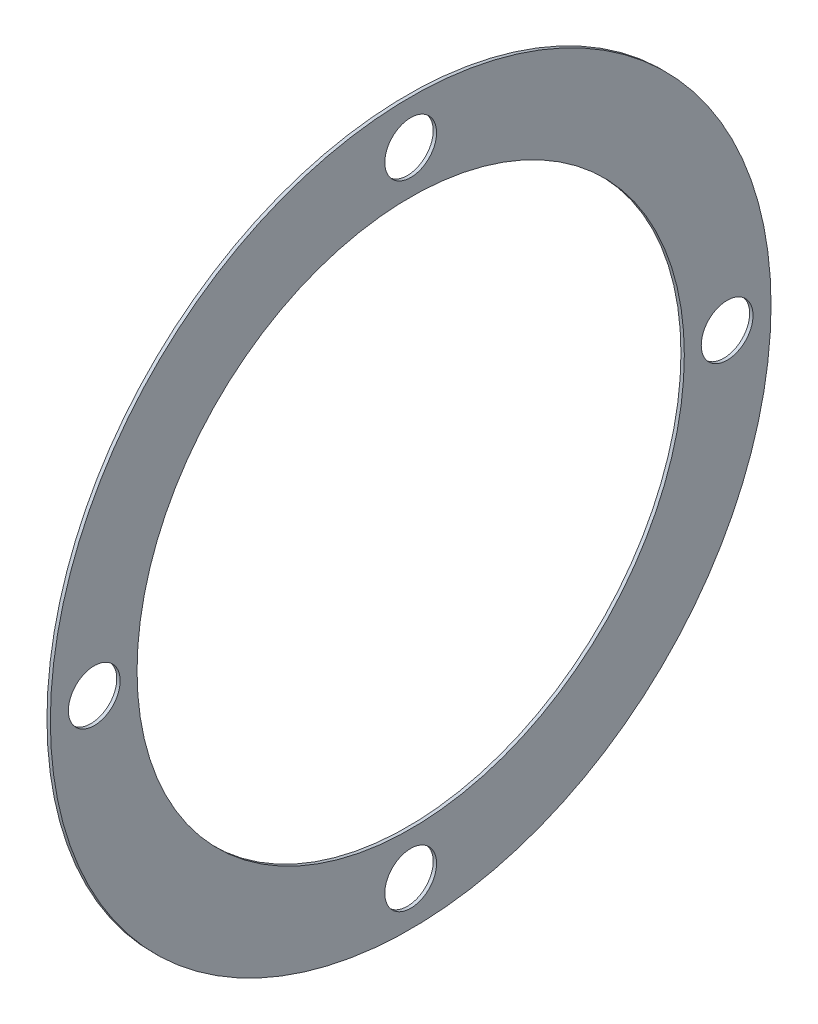
ISO-10303-21;
HEADER;
FILE_DESCRIPTION(('STEP AP214'),'2;1');
FILE_NAME('part.step','',(''),(''),'','','');
FILE_SCHEMA(('AUTOMOTIVE_DESIGN { 1 0 10303 214 1 1 1 1 }'));
ENDSEC;
DATA;
#1=APPLICATION_CONTEXT('core data for automotive mechanical design processes');
#2=APPLICATION_PROTOCOL_DEFINITION('international standard','automotive_design',2000,#1);
#3=PRODUCT_CONTEXT('',#1,'mechanical');
#4=PRODUCT('Part','Part','',(#3));
#5=PRODUCT_RELATED_PRODUCT_CATEGORY('part','',(#4));
#6=PRODUCT_DEFINITION_FORMATION('','',#4);
#7=PRODUCT_DEFINITION_CONTEXT('part definition',#1,'design');
#8=PRODUCT_DEFINITION('design','',#6,#7);
#9=PRODUCT_DEFINITION_SHAPE('','',#8);
#10=(LENGTH_UNIT() NAMED_UNIT(*) SI_UNIT(.MILLI.,.METRE.));
#11=(NAMED_UNIT(*) PLANE_ANGLE_UNIT() SI_UNIT($,.RADIAN.));
#12=(NAMED_UNIT(*) SI_UNIT($,.STERADIAN.) SOLID_ANGLE_UNIT());
#13=UNCERTAINTY_MEASURE_WITH_UNIT(LENGTH_MEASURE(1.E-05),#10,'distance_accuracy_value','');
#14=(GEOMETRIC_REPRESENTATION_CONTEXT(3) GLOBAL_UNCERTAINTY_ASSIGNED_CONTEXT((#13)) GLOBAL_UNIT_ASSIGNED_CONTEXT((#10,
#11,#12)) REPRESENTATION_CONTEXT('',''));
#15=CARTESIAN_POINT('',(0.,0.,0.));
#16=DIRECTION('',(0.,0.,1.));
#17=DIRECTION('',(1.,0.,0.));
#18=AXIS2_PLACEMENT_3D('',#15,#16,#17);
#19=CARTESIAN_POINT('',(0.,0.,0.));
#20=DIRECTION('',(-1.,0.,0.));
#21=DIRECTION('',(0.,0.,1.));
#22=AXIS2_PLACEMENT_3D('',#19,#20,#21);
#23=PLANE('',#22);
#24=CARTESIAN_POINT('',(0.,0.,0.));
#25=DIRECTION('',(-1.,0.,0.));
#26=DIRECTION('',(0.,0.,1.));
#27=AXIS2_PLACEMENT_3D('',#24,#25,#26);
#28=CIRCLE('',#27,16.);
#29=CARTESIAN_POINT('',(0.,0.,16.));
#30=VERTEX_POINT('',#29);
#31=EDGE_CURVE('E41',#30,#30,#28,.T.);
#32=ORIENTED_EDGE('',*,*,#31,.F.);
#33=EDGE_LOOP('',(#32));
#34=FACE_BOUND('',#33,.T.);
#35=CARTESIAN_POINT('',(0.,0.,0.));
#36=DIRECTION('',(-1.,0.,0.));
#37=DIRECTION('',(0.,0.,1.));
#38=AXIS2_PLACEMENT_3D('',#35,#36,#37);
#39=CIRCLE('',#38,12.15);
#40=CARTESIAN_POINT('',(0.,0.,12.15));
#41=VERTEX_POINT('',#40);
#42=EDGE_CURVE('E44',#41,#41,#39,.T.);
#43=ORIENTED_EDGE('',*,*,#42,.T.);
#44=EDGE_LOOP('',(#43));
#45=FACE_BOUND('',#44,.T.);
#46=CARTESIAN_POINT('',(0.,14.05,0.));
#47=DIRECTION('',(-1.,0.,0.));
#48=DIRECTION('',(0.,0.,1.));
#49=AXIS2_PLACEMENT_3D('',#46,#47,#48);
#50=CIRCLE('',#49,1.15);
#51=CARTESIAN_POINT('',(0.,14.05,1.15));
#52=VERTEX_POINT('',#51);
#53=EDGE_CURVE('E47',#52,#52,#50,.T.);
#54=ORIENTED_EDGE('',*,*,#53,.T.);
#55=EDGE_LOOP('',(#54));
#56=FACE_BOUND('',#55,.T.);
#57=CARTESIAN_POINT('',(0.,0.,14.05));
#58=DIRECTION('',(-1.,0.,0.));
#59=DIRECTION('',(0.,0.,1.));
#60=AXIS2_PLACEMENT_3D('',#57,#58,#59);
#61=CIRCLE('',#60,1.15);
#62=CARTESIAN_POINT('',(0.,0.,15.2));
#63=VERTEX_POINT('',#62);
#64=EDGE_CURVE('E50',#63,#63,#61,.T.);
#65=ORIENTED_EDGE('',*,*,#64,.T.);
#66=EDGE_LOOP('',(#65));
#67=FACE_BOUND('',#66,.T.);
#68=CARTESIAN_POINT('',(0.,-14.05,0.));
#69=DIRECTION('',(-1.,0.,0.));
#70=DIRECTION('',(0.,0.,1.));
#71=AXIS2_PLACEMENT_3D('',#68,#69,#70);
#72=CIRCLE('',#71,1.15);
#73=CARTESIAN_POINT('',(0.,-14.05,1.15));
#74=VERTEX_POINT('',#73);
#75=EDGE_CURVE('E52',#74,#74,#72,.T.);
#76=ORIENTED_EDGE('',*,*,#75,.T.);
#77=EDGE_LOOP('',(#76));
#78=FACE_BOUND('',#77,.T.);
#79=CARTESIAN_POINT('',(0.,0.,-14.05));
#80=DIRECTION('',(-1.,0.,0.));
#81=DIRECTION('',(0.,0.,1.));
#82=AXIS2_PLACEMENT_3D('',#79,#80,#81);
#83=CIRCLE('',#82,1.15);
#84=CARTESIAN_POINT('',(0.,0.,-12.9));
#85=VERTEX_POINT('',#84);
#86=EDGE_CURVE('E18',#85,#85,#83,.T.);
#87=ORIENTED_EDGE('',*,*,#86,.T.);
#88=EDGE_LOOP('',(#87));
#89=FACE_BOUND('',#88,.T.);
#90=ADVANCED_FACE('F15',(#34,#45,#56,#67,#78,#89),#23,.F.);
#91=CARTESIAN_POINT('',(0.,0.,-14.05));
#92=DIRECTION('',(-1.,0.,0.));
#93=DIRECTION('',(0.,0.,1.));
#94=AXIS2_PLACEMENT_3D('',#91,#92,#93);
#95=CYLINDRICAL_SURFACE('',#94,1.15);
#96=ORIENTED_EDGE('',*,*,#86,.F.);
#97=EDGE_LOOP('',(#96));
#98=FACE_BOUND('',#97,.T.);
#99=CARTESIAN_POINT('',(-0.15,0.,-14.05));
#100=DIRECTION('',(-1.,0.,0.));
#101=DIRECTION('',(0.,0.,1.));
#102=AXIS2_PLACEMENT_3D('',#99,#100,#101);
#103=CIRCLE('',#102,1.15);
#104=CARTESIAN_POINT('',(-0.15,0.,-12.9));
#105=VERTEX_POINT('',#104);
#106=EDGE_CURVE('E38',#105,#105,#103,.F.);
#107=ORIENTED_EDGE('',*,*,#106,.F.);
#108=EDGE_LOOP('',(#107));
#109=FACE_BOUND('',#108,.T.);
#110=ADVANCED_FACE('F60',(#98,#109),#95,.F.);
#111=CARTESIAN_POINT('',(0.,-14.05,0.));
#112=DIRECTION('',(-1.,0.,0.));
#113=DIRECTION('',(0.,0.,1.));
#114=AXIS2_PLACEMENT_3D('',#111,#112,#113);
#115=CYLINDRICAL_SURFACE('',#114,1.15);
#116=ORIENTED_EDGE('',*,*,#75,.F.);
#117=EDGE_LOOP('',(#116));
#118=FACE_BOUND('',#117,.T.);
#119=CARTESIAN_POINT('',(-0.15,-14.05,0.));
#120=DIRECTION('',(-1.,0.,0.));
#121=DIRECTION('',(0.,0.,1.));
#122=AXIS2_PLACEMENT_3D('',#119,#120,#121);
#123=CIRCLE('',#122,1.15);
#124=CARTESIAN_POINT('',(-0.15,-14.05,1.15));
#125=VERTEX_POINT('',#124);
#126=EDGE_CURVE('E35',#125,#125,#123,.F.);
#127=ORIENTED_EDGE('',*,*,#126,.F.);
#128=EDGE_LOOP('',(#127));
#129=FACE_BOUND('',#128,.T.);
#130=ADVANCED_FACE('F63',(#118,#129),#115,.F.);
#131=CARTESIAN_POINT('',(0.,0.,14.05));
#132=DIRECTION('',(-1.,0.,0.));
#133=DIRECTION('',(0.,0.,1.));
#134=AXIS2_PLACEMENT_3D('',#131,#132,#133);
#135=CYLINDRICAL_SURFACE('',#134,1.15);
#136=ORIENTED_EDGE('',*,*,#64,.F.);
#137=EDGE_LOOP('',(#136));
#138=FACE_BOUND('',#137,.T.);
#139=CARTESIAN_POINT('',(-0.15,0.,14.05));
#140=DIRECTION('',(-1.,0.,0.));
#141=DIRECTION('',(0.,0.,1.));
#142=AXIS2_PLACEMENT_3D('',#139,#140,#141);
#143=CIRCLE('',#142,1.15);
#144=CARTESIAN_POINT('',(-0.15,0.,15.2));
#145=VERTEX_POINT('',#144);
#146=EDGE_CURVE('E32',#145,#145,#143,.F.);
#147=ORIENTED_EDGE('',*,*,#146,.F.);
#148=EDGE_LOOP('',(#147));
#149=FACE_BOUND('',#148,.T.);
#150=ADVANCED_FACE('F85',(#138,#149),#135,.F.);
#151=CARTESIAN_POINT('',(0.,14.05,0.));
#152=DIRECTION('',(-1.,0.,0.));
#153=DIRECTION('',(0.,0.,1.));
#154=AXIS2_PLACEMENT_3D('',#151,#152,#153);
#155=CYLINDRICAL_SURFACE('',#154,1.15);
#156=ORIENTED_EDGE('',*,*,#53,.F.);
#157=EDGE_LOOP('',(#156));
#158=FACE_BOUND('',#157,.T.);
#159=CARTESIAN_POINT('',(-0.15,14.05,0.));
#160=DIRECTION('',(-1.,0.,0.));
#161=DIRECTION('',(0.,0.,1.));
#162=AXIS2_PLACEMENT_3D('',#159,#160,#161);
#163=CIRCLE('',#162,1.15);
#164=CARTESIAN_POINT('',(-0.15,14.05,1.15));
#165=VERTEX_POINT('',#164);
#166=EDGE_CURVE('E27',#165,#165,#163,.F.);
#167=ORIENTED_EDGE('',*,*,#166,.F.);
#168=EDGE_LOOP('',(#167));
#169=FACE_BOUND('',#168,.T.);
#170=ADVANCED_FACE('F81',(#158,#169),#155,.F.);
#171=CARTESIAN_POINT('',(0.007499999999999,0.,0.));
#172=DIRECTION('',(-1.,0.,0.));
#173=DIRECTION('',(0.,0.,1.));
#174=AXIS2_PLACEMENT_3D('',#171,#172,#173);
#175=CYLINDRICAL_SURFACE('',#174,12.15);
#176=ORIENTED_EDGE('',*,*,#42,.F.);
#177=EDGE_LOOP('',(#176));
#178=FACE_BOUND('',#177,.T.);
#179=CARTESIAN_POINT('',(-0.15,0.,0.));
#180=DIRECTION('',(-1.,0.,0.));
#181=DIRECTION('',(0.,0.,1.));
#182=AXIS2_PLACEMENT_3D('',#179,#180,#181);
#183=CIRCLE('',#182,12.15);
#184=CARTESIAN_POINT('',(-0.15,0.,12.15));
#185=VERTEX_POINT('',#184);
#186=EDGE_CURVE('E22',#185,#185,#183,.F.);
#187=ORIENTED_EDGE('',*,*,#186,.F.);
#188=EDGE_LOOP('',(#187));
#189=FACE_BOUND('',#188,.T.);
#190=ADVANCED_FACE('F74',(#178,#189),#175,.F.);
#191=CARTESIAN_POINT('',(0.007499999999999,0.,0.));
#192=DIRECTION('',(-1.,0.,0.));
#193=DIRECTION('',(0.,0.,1.));
#194=AXIS2_PLACEMENT_3D('',#191,#192,#193);
#195=CYLINDRICAL_SURFACE('',#194,16.);
#196=CARTESIAN_POINT('',(-0.15,0.,0.));
#197=DIRECTION('',(-1.,0.,0.));
#198=DIRECTION('',(0.,0.,1.));
#199=AXIS2_PLACEMENT_3D('',#196,#197,#198);
#200=CIRCLE('',#199,16.);
#201=CARTESIAN_POINT('',(-0.15,0.,16.));
#202=VERTEX_POINT('',#201);
#203=EDGE_CURVE('E10',#202,#202,#200,.T.);
#204=ORIENTED_EDGE('',*,*,#203,.F.);
#205=EDGE_LOOP('',(#204));
#206=FACE_BOUND('',#205,.T.);
#207=ORIENTED_EDGE('',*,*,#31,.T.);
#208=EDGE_LOOP('',(#207));
#209=FACE_BOUND('',#208,.T.);
#210=ADVANCED_FACE('F68',(#206,#209),#195,.T.);
#211=CARTESIAN_POINT('',(-0.15,0.,0.));
#212=DIRECTION('',(-1.,0.,0.));
#213=DIRECTION('',(0.,0.,1.));
#214=AXIS2_PLACEMENT_3D('',#211,#212,#213);
#215=PLANE('',#214);
#216=ORIENTED_EDGE('',*,*,#203,.T.);
#217=EDGE_LOOP('',(#216));
#218=FACE_BOUND('',#217,.T.);
#219=ORIENTED_EDGE('',*,*,#186,.T.);
#220=EDGE_LOOP('',(#219));
#221=FACE_BOUND('',#220,.T.);
#222=ORIENTED_EDGE('',*,*,#166,.T.);
#223=EDGE_LOOP('',(#222));
#224=FACE_BOUND('',#223,.T.);
#225=ORIENTED_EDGE('',*,*,#146,.T.);
#226=EDGE_LOOP('',(#225));
#227=FACE_BOUND('',#226,.T.);
#228=ORIENTED_EDGE('',*,*,#126,.T.);
#229=EDGE_LOOP('',(#228));
#230=FACE_BOUND('',#229,.T.);
#231=ORIENTED_EDGE('',*,*,#106,.T.);
#232=EDGE_LOOP('',(#231));
#233=FACE_BOUND('',#232,.T.);
#234=ADVANCED_FACE('F66',(#218,#221,#224,#227,#230,#233),#215,.T.);
#235=CLOSED_SHELL('',(#90,#110,#130,#150,#170,#190,#210,#234));
#236=MANIFOLD_SOLID_BREP('B1',#235);
#237=ADVANCED_BREP_SHAPE_REPRESENTATION('',(#18,#236),#14);
#238=SHAPE_DEFINITION_REPRESENTATION(#9,#237);
ENDSEC;
END-ISO-10303-21;
